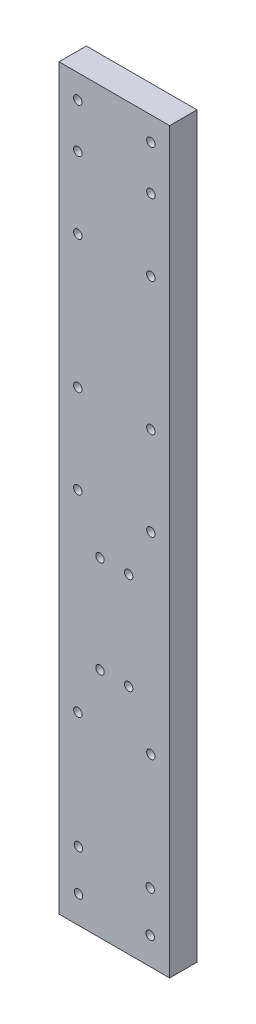
ISO-10303-21;
HEADER;
FILE_DESCRIPTION(('STEP AP214'),'2;1');
FILE_NAME('part.step','',(''),(''),'','','');
FILE_SCHEMA(('AUTOMOTIVE_DESIGN { 1 0 10303 214 1 1 1 1 }'));
ENDSEC;
DATA;
#1=APPLICATION_CONTEXT('core data for automotive mechanical design processes');
#2=APPLICATION_PROTOCOL_DEFINITION('international standard','automotive_design',2000,#1);
#3=PRODUCT_CONTEXT('',#1,'mechanical');
#4=PRODUCT('Part','Part','',(#3));
#5=PRODUCT_RELATED_PRODUCT_CATEGORY('part','',(#4));
#6=PRODUCT_DEFINITION_FORMATION('','',#4);
#7=PRODUCT_DEFINITION_CONTEXT('part definition',#1,'design');
#8=PRODUCT_DEFINITION('design','',#6,#7);
#9=PRODUCT_DEFINITION_SHAPE('','',#8);
#10=(LENGTH_UNIT() NAMED_UNIT(*) SI_UNIT(.MILLI.,.METRE.));
#11=(NAMED_UNIT(*) PLANE_ANGLE_UNIT() SI_UNIT($,.RADIAN.));
#12=(NAMED_UNIT(*) SI_UNIT($,.STERADIAN.) SOLID_ANGLE_UNIT());
#13=UNCERTAINTY_MEASURE_WITH_UNIT(LENGTH_MEASURE(1.E-05),#10,'distance_accuracy_value','');
#14=(GEOMETRIC_REPRESENTATION_CONTEXT(3) GLOBAL_UNCERTAINTY_ASSIGNED_CONTEXT((#13)) GLOBAL_UNIT_ASSIGNED_CONTEXT((#10,
#11,#12)) REPRESENTATION_CONTEXT('',''));
#15=CARTESIAN_POINT('',(0.,0.,0.));
#16=DIRECTION('',(0.,0.,1.));
#17=DIRECTION('',(1.,0.,0.));
#18=AXIS2_PLACEMENT_3D('',#15,#16,#17);
#19=CARTESIAN_POINT('',(0.,0.,4.));
#20=DIRECTION('',(0.,0.,1.));
#21=DIRECTION('',(1.,0.,0.));
#22=AXIS2_PLACEMENT_3D('',#19,#20,#21);
#23=PLANE('',#22);
#24=CARTESIAN_POINT('',(13.35,10.,4.));
#25=DIRECTION('',(0.,0.,1.));
#26=DIRECTION('',(-1.,0.,0.));
#27=AXIS2_PLACEMENT_3D('',#24,#25,#26);
#28=CIRCLE('',#27,0.62);
#29=CARTESIAN_POINT('',(12.73,10.,4.));
#30=VERTEX_POINT('',#29);
#31=EDGE_CURVE('E216',#30,#30,#28,.T.);
#32=ORIENTED_EDGE('',*,*,#31,.F.);
#33=EDGE_LOOP('',(#32));
#34=FACE_BOUND('',#33,.T.);
#35=CARTESIAN_POINT('',(2.85,10.,4.));
#36=DIRECTION('',(0.,0.,1.));
#37=DIRECTION('',(1.,0.,0.));
#38=AXIS2_PLACEMENT_3D('',#35,#36,#37);
#39=CIRCLE('',#38,0.62);
#40=CARTESIAN_POINT('',(3.47,10.,4.));
#41=VERTEX_POINT('',#40);
#42=EDGE_CURVE('E204',#41,#41,#39,.T.);
#43=ORIENTED_EDGE('',*,*,#42,.F.);
#44=EDGE_LOOP('',(#43));
#45=FACE_BOUND('',#44,.T.);
#46=CARTESIAN_POINT('',(2.74999999999998,68.21,4.));
#47=DIRECTION('',(0.,0.,1.));
#48=DIRECTION('',(1.,0.,0.));
#49=AXIS2_PLACEMENT_3D('',#46,#47,#48);
#50=CIRCLE('',#49,0.620000000000002);
#51=CARTESIAN_POINT('',(3.36999999999999,68.21,4.));
#52=VERTEX_POINT('',#51);
#53=EDGE_CURVE('E192',#52,#52,#50,.T.);
#54=ORIENTED_EDGE('',*,*,#53,.F.);
#55=EDGE_LOOP('',(#54));
#56=FACE_BOUND('',#55,.T.);
#57=CARTESIAN_POINT('',(2.74999999999999,55.21,4.));
#58=DIRECTION('',(0.,0.,1.));
#59=DIRECTION('',(1.,0.,0.));
#60=AXIS2_PLACEMENT_3D('',#57,#58,#59);
#61=CIRCLE('',#60,0.62);
#62=CARTESIAN_POINT('',(3.36999999999999,55.21,4.));
#63=VERTEX_POINT('',#62);
#64=EDGE_CURVE('E180',#63,#63,#61,.T.);
#65=ORIENTED_EDGE('',*,*,#64,.F.);
#66=EDGE_LOOP('',(#65));
#67=FACE_BOUND('',#66,.T.);
#68=CARTESIAN_POINT('',(13.45,104.66,4.));
#69=DIRECTION('',(0.,0.,1.));
#70=DIRECTION('',(-1.,0.,0.));
#71=AXIS2_PLACEMENT_3D('',#68,#69,#70);
#72=CIRCLE('',#71,0.620000000000002);
#73=CARTESIAN_POINT('',(12.83,104.66,4.));
#74=VERTEX_POINT('',#73);
#75=EDGE_CURVE('E168',#74,#74,#72,.T.);
#76=ORIENTED_EDGE('',*,*,#75,.F.);
#77=EDGE_LOOP('',(#76));
#78=FACE_BOUND('',#77,.T.);
#79=CARTESIAN_POINT('',(2.74999999999998,87.66,4.));
#80=DIRECTION('',(0.,0.,1.));
#81=DIRECTION('',(-1.,0.,0.));
#82=AXIS2_PLACEMENT_3D('',#79,#80,#81);
#83=CIRCLE('',#82,0.620000000000002);
#84=CARTESIAN_POINT('',(2.12999999999998,87.66,4.));
#85=VERTEX_POINT('',#84);
#86=EDGE_CURVE('E156',#85,#85,#83,.T.);
#87=ORIENTED_EDGE('',*,*,#86,.F.);
#88=EDGE_LOOP('',(#87));
#89=FACE_BOUND('',#88,.T.);
#90=CARTESIAN_POINT('',(2.75,27.,4.));
#91=DIRECTION('',(0.,0.,1.));
#92=DIRECTION('',(1.,0.,0.));
#93=AXIS2_PLACEMENT_3D('',#90,#91,#92);
#94=CIRCLE('',#93,0.62);
#95=CARTESIAN_POINT('',(3.37,27.,4.));
#96=VERTEX_POINT('',#95);
#97=EDGE_CURVE('E144',#96,#96,#94,.T.);
#98=ORIENTED_EDGE('',*,*,#97,.F.);
#99=EDGE_LOOP('',(#98));
#100=FACE_BOUND('',#99,.T.);
#101=CARTESIAN_POINT('',(6.,34.,4.));
#102=DIRECTION('',(0.,0.,1.));
#103=DIRECTION('',(1.,0.,0.));
#104=AXIS2_PLACEMENT_3D('',#101,#102,#103);
#105=CIRCLE('',#104,0.619999999999999);
#106=CARTESIAN_POINT('',(6.62,34.,4.));
#107=VERTEX_POINT('',#106);
#108=EDGE_CURVE('E132',#107,#107,#105,.T.);
#109=ORIENTED_EDGE('',*,*,#108,.F.);
#110=EDGE_LOOP('',(#109));
#111=FACE_BOUND('',#110,.T.);
#112=CARTESIAN_POINT('',(5.99999999999999,48.21,4.));
#113=DIRECTION('',(0.,0.,1.));
#114=DIRECTION('',(1.,0.,0.));
#115=AXIS2_PLACEMENT_3D('',#112,#113,#114);
#116=CIRCLE('',#115,0.619999999999999);
#117=CARTESIAN_POINT('',(6.61999999999999,48.21,4.));
#118=VERTEX_POINT('',#117);
#119=EDGE_CURVE('E120',#118,#118,#116,.T.);
#120=ORIENTED_EDGE('',*,*,#119,.F.);
#121=EDGE_LOOP('',(#120));
#122=FACE_BOUND('',#121,.T.);
#123=CARTESIAN_POINT('',(2.74999999999999,104.66,4.));
#124=DIRECTION('',(0.,0.,1.));
#125=DIRECTION('',(1.,0.,0.));
#126=AXIS2_PLACEMENT_3D('',#123,#124,#125);
#127=CIRCLE('',#126,0.620000000000002);
#128=CARTESIAN_POINT('',(3.36999999999999,104.66,4.));
#129=VERTEX_POINT('',#128);
#130=EDGE_CURVE('E99',#129,#129,#127,.T.);
#131=ORIENTED_EDGE('',*,*,#130,.F.);
#132=EDGE_LOOP('',(#131));
#133=FACE_BOUND('',#132,.T.);
#134=DIRECTION('',(0.,-1.,0.));
#135=VECTOR('',#134,1.);
#136=CARTESIAN_POINT('',(0.,108.14,4.));
#137=LINE('',#136,#135);
#138=CARTESIAN_POINT('',(0.,108.14,4.));
#139=VERTEX_POINT('',#138);
#140=CARTESIAN_POINT('',(0.,0.,4.));
#141=VERTEX_POINT('',#140);
#142=EDGE_CURVE('E84',#139,#141,#137,.T.);
#143=ORIENTED_EDGE('',*,*,#142,.T.);
#144=DIRECTION('',(1.,0.,0.));
#145=VECTOR('',#144,1.);
#146=CARTESIAN_POINT('',(0.,0.,4.));
#147=LINE('',#146,#145);
#148=CARTESIAN_POINT('',(16.2,0.,4.));
#149=VERTEX_POINT('',#148);
#150=EDGE_CURVE('E79',#141,#149,#147,.T.);
#151=ORIENTED_EDGE('',*,*,#150,.T.);
#152=DIRECTION('',(0.,1.,0.));
#153=VECTOR('',#152,1.);
#154=CARTESIAN_POINT('',(16.2,0.,4.));
#155=LINE('',#154,#153);
#156=CARTESIAN_POINT('',(16.2,108.14,4.));
#157=VERTEX_POINT('',#156);
#158=EDGE_CURVE('E82',#149,#157,#155,.T.);
#159=ORIENTED_EDGE('',*,*,#158,.T.);
#160=DIRECTION('',(-1.,0.,0.));
#161=VECTOR('',#160,1.);
#162=CARTESIAN_POINT('',(16.2,108.14,4.));
#163=LINE('',#162,#161);
#164=EDGE_CURVE('E49',#157,#139,#163,.T.);
#165=ORIENTED_EDGE('',*,*,#164,.T.);
#166=EDGE_LOOP('',(#143,#151,#159,#165));
#167=FACE_BOUND('',#166,.T.);
#168=CARTESIAN_POINT('',(10.2,48.21,4.));
#169=DIRECTION('',(0.,0.,1.));
#170=DIRECTION('',(1.,0.,0.));
#171=AXIS2_PLACEMENT_3D('',#168,#169,#170);
#172=CIRCLE('',#171,0.62);
#173=CARTESIAN_POINT('',(10.82,48.21,4.));
#174=VERTEX_POINT('',#173);
#175=EDGE_CURVE('E114',#174,#174,#172,.T.);
#176=ORIENTED_EDGE('',*,*,#175,.F.);
#177=EDGE_LOOP('',(#176));
#178=FACE_BOUND('',#177,.T.);
#179=CARTESIAN_POINT('',(10.2,34.,4.));
#180=DIRECTION('',(0.,0.,1.));
#181=DIRECTION('',(1.,0.,0.));
#182=AXIS2_PLACEMENT_3D('',#179,#180,#181);
#183=CIRCLE('',#182,0.62);
#184=CARTESIAN_POINT('',(10.82,34.,4.));
#185=VERTEX_POINT('',#184);
#186=EDGE_CURVE('E126',#185,#185,#183,.T.);
#187=ORIENTED_EDGE('',*,*,#186,.F.);
#188=EDGE_LOOP('',(#187));
#189=FACE_BOUND('',#188,.T.);
#190=CARTESIAN_POINT('',(13.45,27.,4.));
#191=DIRECTION('',(0.,0.,1.));
#192=DIRECTION('',(1.,0.,0.));
#193=AXIS2_PLACEMENT_3D('',#190,#191,#192);
#194=CIRCLE('',#193,0.62);
#195=CARTESIAN_POINT('',(14.07,27.,4.));
#196=VERTEX_POINT('',#195);
#197=EDGE_CURVE('E138',#196,#196,#194,.T.);
#198=ORIENTED_EDGE('',*,*,#197,.F.);
#199=EDGE_LOOP('',(#198));
#200=FACE_BOUND('',#199,.T.);
#201=CARTESIAN_POINT('',(13.45,55.21,4.));
#202=DIRECTION('',(0.,0.,1.));
#203=DIRECTION('',(1.,0.,0.));
#204=AXIS2_PLACEMENT_3D('',#201,#202,#203);
#205=CIRCLE('',#204,0.62);
#206=CARTESIAN_POINT('',(14.07,55.21,4.));
#207=VERTEX_POINT('',#206);
#208=EDGE_CURVE('E150',#207,#207,#205,.T.);
#209=ORIENTED_EDGE('',*,*,#208,.F.);
#210=EDGE_LOOP('',(#209));
#211=FACE_BOUND('',#210,.T.);
#212=CARTESIAN_POINT('',(13.45,87.66,4.));
#213=DIRECTION('',(0.,0.,1.));
#214=DIRECTION('',(-1.,0.,0.));
#215=AXIS2_PLACEMENT_3D('',#212,#213,#214);
#216=CIRCLE('',#215,0.620000000000002);
#217=CARTESIAN_POINT('',(12.83,87.66,4.));
#218=VERTEX_POINT('',#217);
#219=EDGE_CURVE('E162',#218,#218,#216,.T.);
#220=ORIENTED_EDGE('',*,*,#219,.F.);
#221=EDGE_LOOP('',(#220));
#222=FACE_BOUND('',#221,.T.);
#223=CARTESIAN_POINT('',(13.45,98.16,4.));
#224=DIRECTION('',(0.,0.,1.));
#225=DIRECTION('',(-1.,0.,0.));
#226=AXIS2_PLACEMENT_3D('',#223,#224,#225);
#227=CIRCLE('',#226,0.620000000000002);
#228=CARTESIAN_POINT('',(12.83,98.16,4.));
#229=VERTEX_POINT('',#228);
#230=EDGE_CURVE('E174',#229,#229,#227,.T.);
#231=ORIENTED_EDGE('',*,*,#230,.F.);
#232=EDGE_LOOP('',(#231));
#233=FACE_BOUND('',#232,.T.);
#234=CARTESIAN_POINT('',(13.45,68.21,4.));
#235=DIRECTION('',(0.,0.,1.));
#236=DIRECTION('',(1.,0.,0.));
#237=AXIS2_PLACEMENT_3D('',#234,#235,#236);
#238=CIRCLE('',#237,0.620000000000002);
#239=CARTESIAN_POINT('',(14.07,68.21,4.));
#240=VERTEX_POINT('',#239);
#241=EDGE_CURVE('E186',#240,#240,#238,.T.);
#242=ORIENTED_EDGE('',*,*,#241,.F.);
#243=EDGE_LOOP('',(#242));
#244=FACE_BOUND('',#243,.T.);
#245=CARTESIAN_POINT('',(2.74999999999999,98.16,4.));
#246=DIRECTION('',(0.,0.,1.));
#247=DIRECTION('',(1.,0.,0.));
#248=AXIS2_PLACEMENT_3D('',#245,#246,#247);
#249=CIRCLE('',#248,0.620000000000002);
#250=CARTESIAN_POINT('',(3.36999999999999,98.16,4.));
#251=VERTEX_POINT('',#250);
#252=EDGE_CURVE('E198',#251,#251,#249,.T.);
#253=ORIENTED_EDGE('',*,*,#252,.F.);
#254=EDGE_LOOP('',(#253));
#255=FACE_BOUND('',#254,.T.);
#256=CARTESIAN_POINT('',(2.85,4.,4.));
#257=DIRECTION('',(0.,0.,1.));
#258=DIRECTION('',(1.,0.,0.));
#259=AXIS2_PLACEMENT_3D('',#256,#257,#258);
#260=CIRCLE('',#259,0.62);
#261=CARTESIAN_POINT('',(3.47,4.,4.));
#262=VERTEX_POINT('',#261);
#263=EDGE_CURVE('E210',#262,#262,#260,.T.);
#264=ORIENTED_EDGE('',*,*,#263,.F.);
#265=EDGE_LOOP('',(#264));
#266=FACE_BOUND('',#265,.T.);
#267=CARTESIAN_POINT('',(13.35,4.,4.));
#268=DIRECTION('',(0.,0.,1.));
#269=DIRECTION('',(-1.,0.,0.));
#270=AXIS2_PLACEMENT_3D('',#267,#268,#269);
#271=CIRCLE('',#270,0.620000000000001);
#272=CARTESIAN_POINT('',(12.73,4.,4.));
#273=VERTEX_POINT('',#272);
#274=EDGE_CURVE('E222',#273,#273,#271,.T.);
#275=ORIENTED_EDGE('',*,*,#274,.F.);
#276=EDGE_LOOP('',(#275));
#277=FACE_BOUND('',#276,.T.);
#278=ADVANCED_FACE('F32',(#34,#45,#56,#67,#78,#89,#100,#111,#122,#133,#167,#178,#189,#200,#211,
#222,#233,#244,#255,#266,#277),#23,.T.);
#279=CARTESIAN_POINT('',(0.,0.,0.));
#280=DIRECTION('',(0.,0.,1.));
#281=DIRECTION('',(1.,0.,0.));
#282=AXIS2_PLACEMENT_3D('',#279,#280,#281);
#283=PLANE('',#282);
#284=CARTESIAN_POINT('',(13.35,10.,0.));
#285=DIRECTION('',(0.,0.,1.));
#286=DIRECTION('',(-1.,0.,0.));
#287=AXIS2_PLACEMENT_3D('',#284,#285,#286);
#288=CIRCLE('',#287,0.62);
#289=CARTESIAN_POINT('',(12.73,10.,0.));
#290=VERTEX_POINT('',#289);
#291=EDGE_CURVE('E219',#290,#290,#288,.T.);
#292=ORIENTED_EDGE('',*,*,#291,.T.);
#293=EDGE_LOOP('',(#292));
#294=FACE_BOUND('',#293,.T.);
#295=CARTESIAN_POINT('',(2.85,10.,0.));
#296=DIRECTION('',(0.,0.,1.));
#297=DIRECTION('',(1.,0.,0.));
#298=AXIS2_PLACEMENT_3D('',#295,#296,#297);
#299=CIRCLE('',#298,0.62);
#300=CARTESIAN_POINT('',(3.47,10.,0.));
#301=VERTEX_POINT('',#300);
#302=EDGE_CURVE('E207',#301,#301,#299,.T.);
#303=ORIENTED_EDGE('',*,*,#302,.T.);
#304=EDGE_LOOP('',(#303));
#305=FACE_BOUND('',#304,.T.);
#306=CARTESIAN_POINT('',(2.74999999999998,68.21,0.));
#307=DIRECTION('',(0.,0.,1.));
#308=DIRECTION('',(1.,0.,0.));
#309=AXIS2_PLACEMENT_3D('',#306,#307,#308);
#310=CIRCLE('',#309,0.620000000000002);
#311=CARTESIAN_POINT('',(3.36999999999999,68.21,0.));
#312=VERTEX_POINT('',#311);
#313=EDGE_CURVE('E195',#312,#312,#310,.T.);
#314=ORIENTED_EDGE('',*,*,#313,.T.);
#315=EDGE_LOOP('',(#314));
#316=FACE_BOUND('',#315,.T.);
#317=CARTESIAN_POINT('',(2.74999999999999,55.21,0.));
#318=DIRECTION('',(0.,0.,1.));
#319=DIRECTION('',(1.,0.,0.));
#320=AXIS2_PLACEMENT_3D('',#317,#318,#319);
#321=CIRCLE('',#320,0.62);
#322=CARTESIAN_POINT('',(3.36999999999999,55.21,0.));
#323=VERTEX_POINT('',#322);
#324=EDGE_CURVE('E183',#323,#323,#321,.T.);
#325=ORIENTED_EDGE('',*,*,#324,.T.);
#326=EDGE_LOOP('',(#325));
#327=FACE_BOUND('',#326,.T.);
#328=CARTESIAN_POINT('',(13.45,104.66,0.));
#329=DIRECTION('',(0.,0.,1.));
#330=DIRECTION('',(-1.,0.,0.));
#331=AXIS2_PLACEMENT_3D('',#328,#329,#330);
#332=CIRCLE('',#331,0.620000000000002);
#333=CARTESIAN_POINT('',(12.83,104.66,0.));
#334=VERTEX_POINT('',#333);
#335=EDGE_CURVE('E171',#334,#334,#332,.T.);
#336=ORIENTED_EDGE('',*,*,#335,.T.);
#337=EDGE_LOOP('',(#336));
#338=FACE_BOUND('',#337,.T.);
#339=CARTESIAN_POINT('',(2.74999999999998,87.66,0.));
#340=DIRECTION('',(0.,0.,1.));
#341=DIRECTION('',(-1.,0.,0.));
#342=AXIS2_PLACEMENT_3D('',#339,#340,#341);
#343=CIRCLE('',#342,0.620000000000002);
#344=CARTESIAN_POINT('',(2.12999999999998,87.66,0.));
#345=VERTEX_POINT('',#344);
#346=EDGE_CURVE('E159',#345,#345,#343,.T.);
#347=ORIENTED_EDGE('',*,*,#346,.T.);
#348=EDGE_LOOP('',(#347));
#349=FACE_BOUND('',#348,.T.);
#350=CARTESIAN_POINT('',(2.75,27.,0.));
#351=DIRECTION('',(0.,0.,1.));
#352=DIRECTION('',(1.,0.,0.));
#353=AXIS2_PLACEMENT_3D('',#350,#351,#352);
#354=CIRCLE('',#353,0.62);
#355=CARTESIAN_POINT('',(3.37,27.,0.));
#356=VERTEX_POINT('',#355);
#357=EDGE_CURVE('E147',#356,#356,#354,.T.);
#358=ORIENTED_EDGE('',*,*,#357,.T.);
#359=EDGE_LOOP('',(#358));
#360=FACE_BOUND('',#359,.T.);
#361=CARTESIAN_POINT('',(6.,34.,0.));
#362=DIRECTION('',(0.,0.,1.));
#363=DIRECTION('',(1.,0.,0.));
#364=AXIS2_PLACEMENT_3D('',#361,#362,#363);
#365=CIRCLE('',#364,0.619999999999999);
#366=CARTESIAN_POINT('',(6.62,34.,0.));
#367=VERTEX_POINT('',#366);
#368=EDGE_CURVE('E135',#367,#367,#365,.T.);
#369=ORIENTED_EDGE('',*,*,#368,.T.);
#370=EDGE_LOOP('',(#369));
#371=FACE_BOUND('',#370,.T.);
#372=CARTESIAN_POINT('',(5.99999999999999,48.21,0.));
#373=DIRECTION('',(0.,0.,1.));
#374=DIRECTION('',(1.,0.,0.));
#375=AXIS2_PLACEMENT_3D('',#372,#373,#374);
#376=CIRCLE('',#375,0.619999999999999);
#377=CARTESIAN_POINT('',(6.61999999999999,48.21,0.));
#378=VERTEX_POINT('',#377);
#379=EDGE_CURVE('E123',#378,#378,#376,.T.);
#380=ORIENTED_EDGE('',*,*,#379,.T.);
#381=EDGE_LOOP('',(#380));
#382=FACE_BOUND('',#381,.T.);
#383=CARTESIAN_POINT('',(2.74999999999999,104.66,0.));
#384=DIRECTION('',(0.,0.,1.));
#385=DIRECTION('',(1.,0.,0.));
#386=AXIS2_PLACEMENT_3D('',#383,#384,#385);
#387=CIRCLE('',#386,0.620000000000002);
#388=CARTESIAN_POINT('',(3.36999999999999,104.66,0.));
#389=VERTEX_POINT('',#388);
#390=EDGE_CURVE('E111',#389,#389,#387,.T.);
#391=ORIENTED_EDGE('',*,*,#390,.T.);
#392=EDGE_LOOP('',(#391));
#393=FACE_BOUND('',#392,.T.);
#394=DIRECTION('',(0.,-1.,0.));
#395=VECTOR('',#394,1.);
#396=CARTESIAN_POINT('',(0.,108.14,0.));
#397=LINE('',#396,#395);
#398=CARTESIAN_POINT('',(0.,108.14,0.));
#399=VERTEX_POINT('',#398);
#400=CARTESIAN_POINT('',(0.,0.,0.));
#401=VERTEX_POINT('',#400);
#402=EDGE_CURVE('E96',#399,#401,#397,.T.);
#403=ORIENTED_EDGE('',*,*,#402,.F.);
#404=DIRECTION('',(-1.,0.,0.));
#405=VECTOR('',#404,1.);
#406=CARTESIAN_POINT('',(16.2,108.14,0.));
#407=LINE('',#406,#405);
#408=CARTESIAN_POINT('',(16.2,108.14,0.));
#409=VERTEX_POINT('',#408);
#410=EDGE_CURVE('E72',#409,#399,#407,.T.);
#411=ORIENTED_EDGE('',*,*,#410,.F.);
#412=DIRECTION('',(0.,1.,0.));
#413=VECTOR('',#412,1.);
#414=CARTESIAN_POINT('',(16.2,0.,0.));
#415=LINE('',#414,#413);
#416=CARTESIAN_POINT('',(16.2,0.,0.));
#417=VERTEX_POINT('',#416);
#418=EDGE_CURVE('E66',#417,#409,#415,.T.);
#419=ORIENTED_EDGE('',*,*,#418,.F.);
#420=DIRECTION('',(1.,0.,0.));
#421=VECTOR('',#420,1.);
#422=CARTESIAN_POINT('',(0.,0.,0.));
#423=LINE('',#422,#421);
#424=EDGE_CURVE('E88',#401,#417,#423,.T.);
#425=ORIENTED_EDGE('',*,*,#424,.F.);
#426=EDGE_LOOP('',(#403,#411,#419,#425));
#427=FACE_BOUND('',#426,.T.);
#428=CARTESIAN_POINT('',(10.2,48.21,0.));
#429=DIRECTION('',(0.,0.,1.));
#430=DIRECTION('',(1.,0.,0.));
#431=AXIS2_PLACEMENT_3D('',#428,#429,#430);
#432=CIRCLE('',#431,0.62);
#433=CARTESIAN_POINT('',(10.82,48.21,0.));
#434=VERTEX_POINT('',#433);
#435=EDGE_CURVE('E117',#434,#434,#432,.T.);
#436=ORIENTED_EDGE('',*,*,#435,.T.);
#437=EDGE_LOOP('',(#436));
#438=FACE_BOUND('',#437,.T.);
#439=CARTESIAN_POINT('',(10.2,34.,0.));
#440=DIRECTION('',(0.,0.,1.));
#441=DIRECTION('',(1.,0.,0.));
#442=AXIS2_PLACEMENT_3D('',#439,#440,#441);
#443=CIRCLE('',#442,0.62);
#444=CARTESIAN_POINT('',(10.82,34.,0.));
#445=VERTEX_POINT('',#444);
#446=EDGE_CURVE('E129',#445,#445,#443,.T.);
#447=ORIENTED_EDGE('',*,*,#446,.T.);
#448=EDGE_LOOP('',(#447));
#449=FACE_BOUND('',#448,.T.);
#450=CARTESIAN_POINT('',(13.45,27.,0.));
#451=DIRECTION('',(0.,0.,1.));
#452=DIRECTION('',(1.,0.,0.));
#453=AXIS2_PLACEMENT_3D('',#450,#451,#452);
#454=CIRCLE('',#453,0.62);
#455=CARTESIAN_POINT('',(14.07,27.,0.));
#456=VERTEX_POINT('',#455);
#457=EDGE_CURVE('E141',#456,#456,#454,.T.);
#458=ORIENTED_EDGE('',*,*,#457,.T.);
#459=EDGE_LOOP('',(#458));
#460=FACE_BOUND('',#459,.T.);
#461=CARTESIAN_POINT('',(13.45,55.21,0.));
#462=DIRECTION('',(0.,0.,1.));
#463=DIRECTION('',(1.,0.,0.));
#464=AXIS2_PLACEMENT_3D('',#461,#462,#463);
#465=CIRCLE('',#464,0.62);
#466=CARTESIAN_POINT('',(14.07,55.21,0.));
#467=VERTEX_POINT('',#466);
#468=EDGE_CURVE('E153',#467,#467,#465,.T.);
#469=ORIENTED_EDGE('',*,*,#468,.T.);
#470=EDGE_LOOP('',(#469));
#471=FACE_BOUND('',#470,.T.);
#472=CARTESIAN_POINT('',(13.45,87.66,0.));
#473=DIRECTION('',(0.,0.,1.));
#474=DIRECTION('',(-1.,0.,0.));
#475=AXIS2_PLACEMENT_3D('',#472,#473,#474);
#476=CIRCLE('',#475,0.620000000000002);
#477=CARTESIAN_POINT('',(12.83,87.66,0.));
#478=VERTEX_POINT('',#477);
#479=EDGE_CURVE('E165',#478,#478,#476,.T.);
#480=ORIENTED_EDGE('',*,*,#479,.T.);
#481=EDGE_LOOP('',(#480));
#482=FACE_BOUND('',#481,.T.);
#483=CARTESIAN_POINT('',(13.45,98.16,0.));
#484=DIRECTION('',(0.,0.,1.));
#485=DIRECTION('',(-1.,0.,0.));
#486=AXIS2_PLACEMENT_3D('',#483,#484,#485);
#487=CIRCLE('',#486,0.620000000000002);
#488=CARTESIAN_POINT('',(12.83,98.16,0.));
#489=VERTEX_POINT('',#488);
#490=EDGE_CURVE('E177',#489,#489,#487,.T.);
#491=ORIENTED_EDGE('',*,*,#490,.T.);
#492=EDGE_LOOP('',(#491));
#493=FACE_BOUND('',#492,.T.);
#494=CARTESIAN_POINT('',(13.45,68.21,0.));
#495=DIRECTION('',(0.,0.,1.));
#496=DIRECTION('',(1.,0.,0.));
#497=AXIS2_PLACEMENT_3D('',#494,#495,#496);
#498=CIRCLE('',#497,0.620000000000002);
#499=CARTESIAN_POINT('',(14.07,68.21,0.));
#500=VERTEX_POINT('',#499);
#501=EDGE_CURVE('E189',#500,#500,#498,.T.);
#502=ORIENTED_EDGE('',*,*,#501,.T.);
#503=EDGE_LOOP('',(#502));
#504=FACE_BOUND('',#503,.T.);
#505=CARTESIAN_POINT('',(2.74999999999999,98.16,0.));
#506=DIRECTION('',(0.,0.,1.));
#507=DIRECTION('',(1.,0.,0.));
#508=AXIS2_PLACEMENT_3D('',#505,#506,#507);
#509=CIRCLE('',#508,0.620000000000002);
#510=CARTESIAN_POINT('',(3.36999999999999,98.16,0.));
#511=VERTEX_POINT('',#510);
#512=EDGE_CURVE('E201',#511,#511,#509,.T.);
#513=ORIENTED_EDGE('',*,*,#512,.T.);
#514=EDGE_LOOP('',(#513));
#515=FACE_BOUND('',#514,.T.);
#516=CARTESIAN_POINT('',(2.85,4.,0.));
#517=DIRECTION('',(0.,0.,1.));
#518=DIRECTION('',(1.,0.,0.));
#519=AXIS2_PLACEMENT_3D('',#516,#517,#518);
#520=CIRCLE('',#519,0.62);
#521=CARTESIAN_POINT('',(3.47,4.,0.));
#522=VERTEX_POINT('',#521);
#523=EDGE_CURVE('E213',#522,#522,#520,.T.);
#524=ORIENTED_EDGE('',*,*,#523,.T.);
#525=EDGE_LOOP('',(#524));
#526=FACE_BOUND('',#525,.T.);
#527=CARTESIAN_POINT('',(13.35,4.,0.));
#528=DIRECTION('',(0.,0.,1.));
#529=DIRECTION('',(-1.,0.,0.));
#530=AXIS2_PLACEMENT_3D('',#527,#528,#529);
#531=CIRCLE('',#530,0.620000000000001);
#532=CARTESIAN_POINT('',(12.73,4.,0.));
#533=VERTEX_POINT('',#532);
#534=EDGE_CURVE('E225',#533,#533,#531,.T.);
#535=ORIENTED_EDGE('',*,*,#534,.T.);
#536=EDGE_LOOP('',(#535));
#537=FACE_BOUND('',#536,.T.);
#538=ADVANCED_FACE('F107',(#294,#305,#316,#327,#338,#349,#360,#371,#382,#393,#427,#438,#449,
#460,#471,#482,#493,#504,#515,#526,#537),#283,.F.);
#539=CARTESIAN_POINT('',(0.,108.14,4.));
#540=DIRECTION('',(1.,0.,0.));
#541=DIRECTION('',(0.,1.,0.));
#542=AXIS2_PLACEMENT_3D('',#539,#540,#541);
#543=PLANE('',#542);
#544=ORIENTED_EDGE('',*,*,#402,.T.);
#545=DIRECTION('',(0.,0.,-1.));
#546=VECTOR('',#545,1.);
#547=CARTESIAN_POINT('',(0.,0.,4.));
#548=LINE('',#547,#546);
#549=EDGE_CURVE('E11',#141,#401,#548,.T.);
#550=ORIENTED_EDGE('',*,*,#549,.F.);
#551=ORIENTED_EDGE('',*,*,#142,.F.);
#552=DIRECTION('',(0.,0.,-1.));
#553=VECTOR('',#552,1.);
#554=CARTESIAN_POINT('',(0.,108.14,4.));
#555=LINE('',#554,#553);
#556=EDGE_CURVE('E92',#139,#399,#555,.T.);
#557=ORIENTED_EDGE('',*,*,#556,.T.);
#558=EDGE_LOOP('',(#544,#550,#551,#557));
#559=FACE_BOUND('',#558,.T.);
#560=ADVANCED_FACE('F34',(#559),#543,.F.);
#561=CARTESIAN_POINT('',(0.,0.,4.));
#562=DIRECTION('',(0.,1.,0.));
#563=DIRECTION('',(-1.,0.,0.));
#564=AXIS2_PLACEMENT_3D('',#561,#562,#563);
#565=PLANE('',#564);
#566=ORIENTED_EDGE('',*,*,#424,.T.);
#567=DIRECTION('',(0.,0.,-1.));
#568=VECTOR('',#567,1.);
#569=CARTESIAN_POINT('',(16.2,0.,4.));
#570=LINE('',#569,#568);
#571=EDGE_CURVE('E41',#149,#417,#570,.T.);
#572=ORIENTED_EDGE('',*,*,#571,.F.);
#573=ORIENTED_EDGE('',*,*,#150,.F.);
#574=ORIENTED_EDGE('',*,*,#549,.T.);
#575=EDGE_LOOP('',(#566,#572,#573,#574));
#576=FACE_BOUND('',#575,.T.);
#577=ADVANCED_FACE('F87',(#576),#565,.F.);
#578=CARTESIAN_POINT('',(16.2,0.,4.));
#579=DIRECTION('',(-1.,0.,0.));
#580=DIRECTION('',(0.,-1.,0.));
#581=AXIS2_PLACEMENT_3D('',#578,#579,#580);
#582=PLANE('',#581);
#583=ORIENTED_EDGE('',*,*,#418,.T.);
#584=DIRECTION('',(0.,0.,-1.));
#585=VECTOR('',#584,1.);
#586=CARTESIAN_POINT('',(16.2,108.14,4.));
#587=LINE('',#586,#585);
#588=EDGE_CURVE('E89',#157,#409,#587,.T.);
#589=ORIENTED_EDGE('',*,*,#588,.F.);
#590=ORIENTED_EDGE('',*,*,#158,.F.);
#591=ORIENTED_EDGE('',*,*,#571,.T.);
#592=EDGE_LOOP('',(#583,#589,#590,#591));
#593=FACE_BOUND('',#592,.T.);
#594=ADVANCED_FACE('F90',(#593),#582,.F.);
#595=CARTESIAN_POINT('',(16.2,108.14,4.));
#596=DIRECTION('',(0.,-1.,0.));
#597=DIRECTION('',(0.,0.,-1.));
#598=AXIS2_PLACEMENT_3D('',#595,#596,#597);
#599=PLANE('',#598);
#600=ORIENTED_EDGE('',*,*,#410,.T.);
#601=ORIENTED_EDGE('',*,*,#556,.F.);
#602=ORIENTED_EDGE('',*,*,#164,.F.);
#603=ORIENTED_EDGE('',*,*,#588,.T.);
#604=EDGE_LOOP('',(#600,#601,#602,#603));
#605=FACE_BOUND('',#604,.T.);
#606=ADVANCED_FACE('F104',(#605),#599,.F.);
#607=CARTESIAN_POINT('',(2.74999999999999,104.66,4.));
#608=DIRECTION('',(0.,0.,-1.));
#609=DIRECTION('',(-1.,0.,0.));
#610=AXIS2_PLACEMENT_3D('',#607,#608,#609);
#611=CYLINDRICAL_SURFACE('',#610,0.620000000000002);
#612=ORIENTED_EDGE('',*,*,#130,.T.);
#613=EDGE_LOOP('',(#612));
#614=FACE_BOUND('',#613,.T.);
#615=ORIENTED_EDGE('',*,*,#390,.F.);
#616=EDGE_LOOP('',(#615));
#617=FACE_BOUND('',#616,.T.);
#618=ADVANCED_FACE('F245',(#614,#617),#611,.F.);
#619=CARTESIAN_POINT('',(10.2,48.21,4.));
#620=DIRECTION('',(0.,0.,-1.));
#621=DIRECTION('',(-1.,0.,0.));
#622=AXIS2_PLACEMENT_3D('',#619,#620,#621);
#623=CYLINDRICAL_SURFACE('',#622,0.62);
#624=ORIENTED_EDGE('',*,*,#175,.T.);
#625=EDGE_LOOP('',(#624));
#626=FACE_BOUND('',#625,.T.);
#627=ORIENTED_EDGE('',*,*,#435,.F.);
#628=EDGE_LOOP('',(#627));
#629=FACE_BOUND('',#628,.T.);
#630=ADVANCED_FACE('F291',(#626,#629),#623,.F.);
#631=CARTESIAN_POINT('',(5.99999999999999,48.21,4.));
#632=DIRECTION('',(0.,0.,-1.));
#633=DIRECTION('',(-1.,0.,0.));
#634=AXIS2_PLACEMENT_3D('',#631,#632,#633);
#635=CYLINDRICAL_SURFACE('',#634,0.619999999999999);
#636=ORIENTED_EDGE('',*,*,#119,.T.);
#637=EDGE_LOOP('',(#636));
#638=FACE_BOUND('',#637,.T.);
#639=ORIENTED_EDGE('',*,*,#379,.F.);
#640=EDGE_LOOP('',(#639));
#641=FACE_BOUND('',#640,.T.);
#642=ADVANCED_FACE('F299',(#638,#641),#635,.F.);
#643=CARTESIAN_POINT('',(10.2,34.,4.));
#644=DIRECTION('',(0.,0.,-1.));
#645=DIRECTION('',(-1.,0.,0.));
#646=AXIS2_PLACEMENT_3D('',#643,#644,#645);
#647=CYLINDRICAL_SURFACE('',#646,0.62);
#648=ORIENTED_EDGE('',*,*,#186,.T.);
#649=EDGE_LOOP('',(#648));
#650=FACE_BOUND('',#649,.T.);
#651=ORIENTED_EDGE('',*,*,#446,.F.);
#652=EDGE_LOOP('',(#651));
#653=FACE_BOUND('',#652,.T.);
#654=ADVANCED_FACE('F307',(#650,#653),#647,.F.);
#655=CARTESIAN_POINT('',(6.,34.,4.));
#656=DIRECTION('',(0.,0.,-1.));
#657=DIRECTION('',(-1.,0.,0.));
#658=AXIS2_PLACEMENT_3D('',#655,#656,#657);
#659=CYLINDRICAL_SURFACE('',#658,0.619999999999999);
#660=ORIENTED_EDGE('',*,*,#108,.T.);
#661=EDGE_LOOP('',(#660));
#662=FACE_BOUND('',#661,.T.);
#663=ORIENTED_EDGE('',*,*,#368,.F.);
#664=EDGE_LOOP('',(#663));
#665=FACE_BOUND('',#664,.T.);
#666=ADVANCED_FACE('F316',(#662,#665),#659,.F.);
#667=CARTESIAN_POINT('',(13.45,27.,4.));
#668=DIRECTION('',(0.,0.,-1.));
#669=DIRECTION('',(-1.,0.,0.));
#670=AXIS2_PLACEMENT_3D('',#667,#668,#669);
#671=CYLINDRICAL_SURFACE('',#670,0.62);
#672=ORIENTED_EDGE('',*,*,#197,.T.);
#673=EDGE_LOOP('',(#672));
#674=FACE_BOUND('',#673,.T.);
#675=ORIENTED_EDGE('',*,*,#457,.F.);
#676=EDGE_LOOP('',(#675));
#677=FACE_BOUND('',#676,.T.);
#678=ADVANCED_FACE('F325',(#674,#677),#671,.F.);
#679=CARTESIAN_POINT('',(2.75,27.,4.));
#680=DIRECTION('',(0.,0.,-1.));
#681=DIRECTION('',(-1.,0.,0.));
#682=AXIS2_PLACEMENT_3D('',#679,#680,#681);
#683=CYLINDRICAL_SURFACE('',#682,0.62);
#684=ORIENTED_EDGE('',*,*,#97,.T.);
#685=EDGE_LOOP('',(#684));
#686=FACE_BOUND('',#685,.T.);
#687=ORIENTED_EDGE('',*,*,#357,.F.);
#688=EDGE_LOOP('',(#687));
#689=FACE_BOUND('',#688,.T.);
#690=ADVANCED_FACE('F334',(#686,#689),#683,.F.);
#691=CARTESIAN_POINT('',(13.45,55.21,4.));
#692=DIRECTION('',(0.,0.,-1.));
#693=DIRECTION('',(-1.,0.,0.));
#694=AXIS2_PLACEMENT_3D('',#691,#692,#693);
#695=CYLINDRICAL_SURFACE('',#694,0.62);
#696=ORIENTED_EDGE('',*,*,#208,.T.);
#697=EDGE_LOOP('',(#696));
#698=FACE_BOUND('',#697,.T.);
#699=ORIENTED_EDGE('',*,*,#468,.F.);
#700=EDGE_LOOP('',(#699));
#701=FACE_BOUND('',#700,.T.);
#702=ADVANCED_FACE('F343',(#698,#701),#695,.F.);
#703=CARTESIAN_POINT('',(2.74999999999998,87.66,4.));
#704=DIRECTION('',(0.,0.,-1.));
#705=DIRECTION('',(-1.,0.,0.));
#706=AXIS2_PLACEMENT_3D('',#703,#704,#705);
#707=CYLINDRICAL_SURFACE('',#706,0.620000000000002);
#708=ORIENTED_EDGE('',*,*,#86,.T.);
#709=EDGE_LOOP('',(#708));
#710=FACE_BOUND('',#709,.T.);
#711=ORIENTED_EDGE('',*,*,#346,.F.);
#712=EDGE_LOOP('',(#711));
#713=FACE_BOUND('',#712,.T.);
#714=ADVANCED_FACE('F352',(#710,#713),#707,.F.);
#715=CARTESIAN_POINT('',(13.45,87.66,4.));
#716=DIRECTION('',(0.,0.,-1.));
#717=DIRECTION('',(-1.,0.,0.));
#718=AXIS2_PLACEMENT_3D('',#715,#716,#717);
#719=CYLINDRICAL_SURFACE('',#718,0.620000000000002);
#720=ORIENTED_EDGE('',*,*,#219,.T.);
#721=EDGE_LOOP('',(#720));
#722=FACE_BOUND('',#721,.T.);
#723=ORIENTED_EDGE('',*,*,#479,.F.);
#724=EDGE_LOOP('',(#723));
#725=FACE_BOUND('',#724,.T.);
#726=ADVANCED_FACE('F361',(#722,#725),#719,.F.);
#727=CARTESIAN_POINT('',(13.45,104.66,4.));
#728=DIRECTION('',(0.,0.,-1.));
#729=DIRECTION('',(-1.,0.,0.));
#730=AXIS2_PLACEMENT_3D('',#727,#728,#729);
#731=CYLINDRICAL_SURFACE('',#730,0.620000000000002);
#732=ORIENTED_EDGE('',*,*,#75,.T.);
#733=EDGE_LOOP('',(#732));
#734=FACE_BOUND('',#733,.T.);
#735=ORIENTED_EDGE('',*,*,#335,.F.);
#736=EDGE_LOOP('',(#735));
#737=FACE_BOUND('',#736,.T.);
#738=ADVANCED_FACE('F370',(#734,#737),#731,.F.);
#739=CARTESIAN_POINT('',(13.45,98.16,4.));
#740=DIRECTION('',(0.,0.,-1.));
#741=DIRECTION('',(-1.,0.,0.));
#742=AXIS2_PLACEMENT_3D('',#739,#740,#741);
#743=CYLINDRICAL_SURFACE('',#742,0.620000000000002);
#744=ORIENTED_EDGE('',*,*,#230,.T.);
#745=EDGE_LOOP('',(#744));
#746=FACE_BOUND('',#745,.T.);
#747=ORIENTED_EDGE('',*,*,#490,.F.);
#748=EDGE_LOOP('',(#747));
#749=FACE_BOUND('',#748,.T.);
#750=ADVANCED_FACE('F379',(#746,#749),#743,.F.);
#751=CARTESIAN_POINT('',(2.74999999999999,55.21,4.));
#752=DIRECTION('',(0.,0.,-1.));
#753=DIRECTION('',(-1.,0.,0.));
#754=AXIS2_PLACEMENT_3D('',#751,#752,#753);
#755=CYLINDRICAL_SURFACE('',#754,0.62);
#756=ORIENTED_EDGE('',*,*,#64,.T.);
#757=EDGE_LOOP('',(#756));
#758=FACE_BOUND('',#757,.T.);
#759=ORIENTED_EDGE('',*,*,#324,.F.);
#760=EDGE_LOOP('',(#759));
#761=FACE_BOUND('',#760,.T.);
#762=ADVANCED_FACE('F388',(#758,#761),#755,.F.);
#763=CARTESIAN_POINT('',(13.45,68.21,4.));
#764=DIRECTION('',(0.,0.,-1.));
#765=DIRECTION('',(-1.,0.,0.));
#766=AXIS2_PLACEMENT_3D('',#763,#764,#765);
#767=CYLINDRICAL_SURFACE('',#766,0.620000000000002);
#768=ORIENTED_EDGE('',*,*,#241,.T.);
#769=EDGE_LOOP('',(#768));
#770=FACE_BOUND('',#769,.T.);
#771=ORIENTED_EDGE('',*,*,#501,.F.);
#772=EDGE_LOOP('',(#771));
#773=FACE_BOUND('',#772,.T.);
#774=ADVANCED_FACE('F397',(#770,#773),#767,.F.);
#775=CARTESIAN_POINT('',(2.74999999999998,68.21,4.));
#776=DIRECTION('',(0.,0.,-1.));
#777=DIRECTION('',(-1.,0.,0.));
#778=AXIS2_PLACEMENT_3D('',#775,#776,#777);
#779=CYLINDRICAL_SURFACE('',#778,0.620000000000002);
#780=ORIENTED_EDGE('',*,*,#53,.T.);
#781=EDGE_LOOP('',(#780));
#782=FACE_BOUND('',#781,.T.);
#783=ORIENTED_EDGE('',*,*,#313,.F.);
#784=EDGE_LOOP('',(#783));
#785=FACE_BOUND('',#784,.T.);
#786=ADVANCED_FACE('F406',(#782,#785),#779,.F.);
#787=CARTESIAN_POINT('',(2.74999999999999,98.16,4.));
#788=DIRECTION('',(0.,0.,-1.));
#789=DIRECTION('',(-1.,0.,0.));
#790=AXIS2_PLACEMENT_3D('',#787,#788,#789);
#791=CYLINDRICAL_SURFACE('',#790,0.620000000000002);
#792=ORIENTED_EDGE('',*,*,#252,.T.);
#793=EDGE_LOOP('',(#792));
#794=FACE_BOUND('',#793,.T.);
#795=ORIENTED_EDGE('',*,*,#512,.F.);
#796=EDGE_LOOP('',(#795));
#797=FACE_BOUND('',#796,.T.);
#798=ADVANCED_FACE('F415',(#794,#797),#791,.F.);
#799=CARTESIAN_POINT('',(2.85,10.,4.));
#800=DIRECTION('',(0.,0.,-1.));
#801=DIRECTION('',(-1.,0.,0.));
#802=AXIS2_PLACEMENT_3D('',#799,#800,#801);
#803=CYLINDRICAL_SURFACE('',#802,0.62);
#804=ORIENTED_EDGE('',*,*,#42,.T.);
#805=EDGE_LOOP('',(#804));
#806=FACE_BOUND('',#805,.T.);
#807=ORIENTED_EDGE('',*,*,#302,.F.);
#808=EDGE_LOOP('',(#807));
#809=FACE_BOUND('',#808,.T.);
#810=ADVANCED_FACE('F424',(#806,#809),#803,.F.);
#811=CARTESIAN_POINT('',(2.85,4.,4.));
#812=DIRECTION('',(0.,0.,-1.));
#813=DIRECTION('',(-1.,0.,0.));
#814=AXIS2_PLACEMENT_3D('',#811,#812,#813);
#815=CYLINDRICAL_SURFACE('',#814,0.62);
#816=ORIENTED_EDGE('',*,*,#263,.T.);
#817=EDGE_LOOP('',(#816));
#818=FACE_BOUND('',#817,.T.);
#819=ORIENTED_EDGE('',*,*,#523,.F.);
#820=EDGE_LOOP('',(#819));
#821=FACE_BOUND('',#820,.T.);
#822=ADVANCED_FACE('F433',(#818,#821),#815,.F.);
#823=CARTESIAN_POINT('',(13.35,10.,4.));
#824=DIRECTION('',(0.,0.,-1.));
#825=DIRECTION('',(-1.,0.,0.));
#826=AXIS2_PLACEMENT_3D('',#823,#824,#825);
#827=CYLINDRICAL_SURFACE('',#826,0.62);
#828=ORIENTED_EDGE('',*,*,#31,.T.);
#829=EDGE_LOOP('',(#828));
#830=FACE_BOUND('',#829,.T.);
#831=ORIENTED_EDGE('',*,*,#291,.F.);
#832=EDGE_LOOP('',(#831));
#833=FACE_BOUND('',#832,.T.);
#834=ADVANCED_FACE('F442',(#830,#833),#827,.F.);
#835=CARTESIAN_POINT('',(13.35,4.,4.));
#836=DIRECTION('',(0.,0.,-1.));
#837=DIRECTION('',(-1.,0.,0.));
#838=AXIS2_PLACEMENT_3D('',#835,#836,#837);
#839=CYLINDRICAL_SURFACE('',#838,0.620000000000001);
#840=ORIENTED_EDGE('',*,*,#274,.T.);
#841=EDGE_LOOP('',(#840));
#842=FACE_BOUND('',#841,.T.);
#843=ORIENTED_EDGE('',*,*,#534,.F.);
#844=EDGE_LOOP('',(#843));
#845=FACE_BOUND('',#844,.T.);
#846=ADVANCED_FACE('F231',(#842,#845),#839,.F.);
#847=CLOSED_SHELL('',(#278,#538,#560,#577,#594,#606,#618,#630,#642,#654,#666,#678,#690,#702,
#714,#726,#738,#750,#762,#774,#786,#798,#810,#822,#834,#846));
#848=MANIFOLD_SOLID_BREP('B2',#847);
#849=ADVANCED_BREP_SHAPE_REPRESENTATION('',(#18,#848),#14);
#850=SHAPE_DEFINITION_REPRESENTATION(#9,#849);
ENDSEC;
END-ISO-10303-21;
